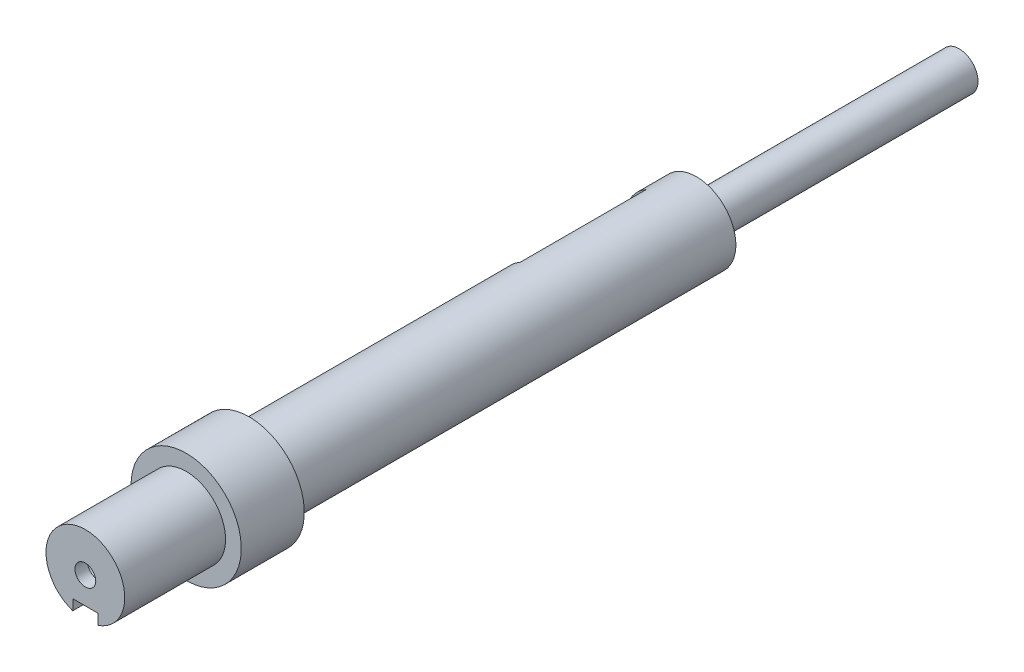
ISO-10303-21;
HEADER;
FILE_DESCRIPTION(('STEP AP214'),'2;1');
FILE_NAME('part.step','',(''),(''),'','','');
FILE_SCHEMA(('AUTOMOTIVE_DESIGN { 1 0 10303 214 1 1 1 1 }'));
ENDSEC;
DATA;
#1=APPLICATION_CONTEXT('core data for automotive mechanical design processes');
#2=APPLICATION_PROTOCOL_DEFINITION('international standard','automotive_design',2000,#1);
#3=PRODUCT_CONTEXT('',#1,'mechanical');
#4=PRODUCT('Part','Part','',(#3));
#5=PRODUCT_RELATED_PRODUCT_CATEGORY('part','',(#4));
#6=PRODUCT_DEFINITION_FORMATION('','',#4);
#7=PRODUCT_DEFINITION_CONTEXT('part definition',#1,'design');
#8=PRODUCT_DEFINITION('design','',#6,#7);
#9=PRODUCT_DEFINITION_SHAPE('','',#8);
#10=(LENGTH_UNIT() NAMED_UNIT(*) SI_UNIT(.MILLI.,.METRE.));
#11=(NAMED_UNIT(*) PLANE_ANGLE_UNIT() SI_UNIT($,.RADIAN.));
#12=(NAMED_UNIT(*) SI_UNIT($,.STERADIAN.) SOLID_ANGLE_UNIT());
#13=UNCERTAINTY_MEASURE_WITH_UNIT(LENGTH_MEASURE(1.E-05),#10,'distance_accuracy_value','');
#14=(GEOMETRIC_REPRESENTATION_CONTEXT(3) GLOBAL_UNCERTAINTY_ASSIGNED_CONTEXT((#13)) GLOBAL_UNIT_ASSIGNED_CONTEXT((#10,
#11,#12)) REPRESENTATION_CONTEXT('',''));
#15=CARTESIAN_POINT('',(0.,0.,0.));
#16=DIRECTION('',(0.,0.,1.));
#17=DIRECTION('',(1.,0.,0.));
#18=AXIS2_PLACEMENT_3D('',#15,#16,#17);
#19=CARTESIAN_POINT('',(0.,0.,0.));
#20=DIRECTION('',(0.,0.,1.));
#21=DIRECTION('',(1.,0.,0.));
#22=AXIS2_PLACEMENT_3D('',#19,#20,#21);
#23=PLANE('',#22);
#24=DIRECTION('',(1.,0.,0.));
#25=VECTOR('',#24,1.);
#26=CARTESIAN_POINT('',(0.,-8.5,0.));
#27=LINE('',#26,#25);
#28=CARTESIAN_POINT('',(-4.,-8.5,0.));
#29=VERTEX_POINT('',#28);
#30=CARTESIAN_POINT('',(4.,-8.5,0.));
#31=VERTEX_POINT('',#30);
#32=EDGE_CURVE('E54',#29,#31,#27,.T.);
#33=ORIENTED_EDGE('',*,*,#32,.F.);
#34=DIRECTION('',(0.,-1.,0.));
#35=VECTOR('',#34,1.);
#36=CARTESIAN_POINT('',(-4.,0.,0.));
#37=LINE('',#36,#35);
#38=CARTESIAN_POINT('',(-4.,-11.842719282327,0.));
#39=VERTEX_POINT('',#38);
#40=EDGE_CURVE('E135',#29,#39,#37,.T.);
#41=ORIENTED_EDGE('',*,*,#40,.T.);
#42=CARTESIAN_POINT('',(0.,0.,0.));
#43=DIRECTION('',(0.,0.,1.));
#44=DIRECTION('',(1.,0.,0.));
#45=AXIS2_PLACEMENT_3D('',#42,#43,#44);
#46=CIRCLE('',#45,12.5);
#47=CARTESIAN_POINT('',(4.,-11.842719282327,0.));
#48=VERTEX_POINT('',#47);
#49=EDGE_CURVE('E171',#39,#48,#46,.T.);
#50=ORIENTED_EDGE('',*,*,#49,.T.);
#51=DIRECTION('',(0.,-1.,0.));
#52=VECTOR('',#51,1.);
#53=CARTESIAN_POINT('',(4.00000000000001,0.,0.));
#54=LINE('',#53,#52);
#55=EDGE_CURVE('E59',#31,#48,#54,.T.);
#56=ORIENTED_EDGE('',*,*,#55,.F.);
#57=EDGE_LOOP('',(#33,#41,#50,#56));
#58=FACE_BOUND('',#57,.T.);
#59=ADVANCED_FACE('F37',(#58),#23,.T.);
#60=CARTESIAN_POINT('',(0.,0.,-22.));
#61=DIRECTION('',(0.,0.,-1.));
#62=DIRECTION('',(-1.,0.,0.));
#63=AXIS2_PLACEMENT_3D('',#60,#61,#62);
#64=CYLINDRICAL_SURFACE('',#63,17.5);
#65=CARTESIAN_POINT('',(0.,0.,-22.));
#66=DIRECTION('',(0.,0.,-1.));
#67=DIRECTION('',(-1.,0.,0.));
#68=AXIS2_PLACEMENT_3D('',#65,#66,#67);
#69=CIRCLE('',#68,17.5);
#70=CARTESIAN_POINT('',(-17.5,0.,-22.));
#71=VERTEX_POINT('',#70);
#72=EDGE_CURVE('E235',#71,#71,#69,.T.);
#73=ORIENTED_EDGE('',*,*,#72,.T.);
#74=EDGE_LOOP('',(#73));
#75=FACE_BOUND('',#74,.T.);
#76=CARTESIAN_POINT('',(0.,0.,-42.));
#77=DIRECTION('',(0.,0.,-1.));
#78=DIRECTION('',(-1.,0.,0.));
#79=AXIS2_PLACEMENT_3D('',#76,#77,#78);
#80=CIRCLE('',#79,17.5);
#81=CARTESIAN_POINT('',(-17.5,0.,-42.));
#82=VERTEX_POINT('',#81);
#83=EDGE_CURVE('E179',#82,#82,#80,.T.);
#84=ORIENTED_EDGE('',*,*,#83,.F.);
#85=EDGE_LOOP('',(#84));
#86=FACE_BOUND('',#85,.T.);
#87=ADVANCED_FACE('F243',(#75,#86),#64,.T.);
#88=CARTESIAN_POINT('',(0.,0.,-184.));
#89=DIRECTION('',(0.,0.,1.));
#90=DIRECTION('',(1.,0.,0.));
#91=AXIS2_PLACEMENT_3D('',#88,#89,#90);
#92=CYLINDRICAL_SURFACE('',#91,12.5);
#93=ORIENTED_EDGE('',*,*,#49,.F.);
#94=DIRECTION('',(0.,0.,-1.));
#95=VECTOR('',#94,1.);
#96=CARTESIAN_POINT('',(-4.,-11.842719282327,10.));
#97=LINE('',#96,#95);
#98=CARTESIAN_POINT('',(-4.,-11.842719282327,10.));
#99=VERTEX_POINT('',#98);
#100=EDGE_CURVE('E155',#99,#39,#97,.T.);
#101=ORIENTED_EDGE('',*,*,#100,.F.);
#102=CARTESIAN_POINT('',(0.,0.,10.));
#103=DIRECTION('',(0.,0.,1.));
#104=DIRECTION('',(1.,0.,0.));
#105=AXIS2_PLACEMENT_3D('',#102,#103,#104);
#106=CIRCLE('',#105,12.5);
#107=CARTESIAN_POINT('',(4.,-11.842719282327,10.));
#108=VERTEX_POINT('',#107);
#109=EDGE_CURVE('E137',#108,#99,#106,.T.);
#110=ORIENTED_EDGE('',*,*,#109,.F.);
#111=DIRECTION('',(0.,0.,-1.));
#112=VECTOR('',#111,1.);
#113=CARTESIAN_POINT('',(4.,-11.842719282327,10.));
#114=LINE('',#113,#112);
#115=EDGE_CURVE('E151',#108,#48,#114,.T.);
#116=ORIENTED_EDGE('',*,*,#115,.T.);
#117=EDGE_LOOP('',(#93,#101,#110,#116));
#118=FACE_BOUND('',#117,.T.);
#119=CARTESIAN_POINT('',(0.,0.,-22.));
#120=DIRECTION('',(0.,0.,-1.));
#121=DIRECTION('',(-1.,0.,0.));
#122=AXIS2_PLACEMENT_3D('',#119,#120,#121);
#123=CIRCLE('',#122,12.5);
#124=CARTESIAN_POINT('',(-12.5,0.,-22.));
#125=VERTEX_POINT('',#124);
#126=EDGE_CURVE('E46',#125,#125,#123,.T.);
#127=ORIENTED_EDGE('',*,*,#126,.F.);
#128=EDGE_LOOP('',(#127));
#129=FACE_BOUND('',#128,.T.);
#130=ADVANCED_FACE('F173',(#118,#129),#92,.T.);
#131=CARTESIAN_POINT('',(0.,0.,-22.));
#132=DIRECTION('',(0.,0.,-1.));
#133=DIRECTION('',(-1.,0.,0.));
#134=AXIS2_PLACEMENT_3D('',#131,#132,#133);
#135=PLANE('',#134);
#136=ORIENTED_EDGE('',*,*,#126,.T.);
#137=EDGE_LOOP('',(#136));
#138=FACE_BOUND('',#137,.T.);
#139=ORIENTED_EDGE('',*,*,#72,.F.);
#140=EDGE_LOOP('',(#139));
#141=FACE_BOUND('',#140,.T.);
#142=ADVANCED_FACE('F251',(#138,#141),#135,.F.);
#143=CARTESIAN_POINT('',(0.,0.,-42.));
#144=DIRECTION('',(0.,0.,-1.));
#145=DIRECTION('',(-1.,0.,0.));
#146=AXIS2_PLACEMENT_3D('',#143,#144,#145);
#147=PLANE('',#146);
#148=CARTESIAN_POINT('',(0.,0.,-42.));
#149=DIRECTION('',(0.,0.,-1.));
#150=DIRECTION('',(-1.,0.,0.));
#151=AXIS2_PLACEMENT_3D('',#148,#149,#150);
#152=CIRCLE('',#151,12.5);
#153=CARTESIAN_POINT('',(-12.5,0.,-42.));
#154=VERTEX_POINT('',#153);
#155=EDGE_CURVE('E177',#154,#154,#152,.T.);
#156=ORIENTED_EDGE('',*,*,#155,.F.);
#157=EDGE_LOOP('',(#156));
#158=FACE_BOUND('',#157,.T.);
#159=ORIENTED_EDGE('',*,*,#83,.T.);
#160=EDGE_LOOP('',(#159));
#161=FACE_BOUND('',#160,.T.);
#162=ADVANCED_FACE('F241',(#158,#161),#147,.T.);
#163=CARTESIAN_POINT('',(3.39095353514196,1.5,-264.38));
#164=DIRECTION('',(1.,0.,0.));
#165=DIRECTION('',(0.,1.,0.));
#166=AXIS2_PLACEMENT_3D('',#163,#164,#165);
#167=PLANE('',#166);
#168=DIRECTION('',(0.,-1.,0.));
#169=VECTOR('',#168,1.);
#170=CARTESIAN_POINT('',(3.39095353514196,1.5,-267.38));
#171=LINE('',#170,#169);
#172=CARTESIAN_POINT('',(3.39095353514196,1.5,-267.38));
#173=VERTEX_POINT('',#172);
#174=CARTESIAN_POINT('',(3.39095353514196,-1.5,-267.38));
#175=VERTEX_POINT('',#174);
#176=EDGE_CURVE('E215',#173,#175,#171,.T.);
#177=ORIENTED_EDGE('',*,*,#176,.T.);
#178=DIRECTION('',(0.,0.,-1.));
#179=VECTOR('',#178,1.);
#180=CARTESIAN_POINT('',(3.39095353514196,-1.5,-264.38));
#181=LINE('',#180,#179);
#182=CARTESIAN_POINT('',(3.39095353514196,-1.5,-264.38));
#183=VERTEX_POINT('',#182);
#184=EDGE_CURVE('E206',#183,#175,#181,.T.);
#185=ORIENTED_EDGE('',*,*,#184,.F.);
#186=DIRECTION('',(0.,-1.,0.));
#187=VECTOR('',#186,1.);
#188=CARTESIAN_POINT('',(3.39095353514196,1.5,-264.38));
#189=LINE('',#188,#187);
#190=CARTESIAN_POINT('',(3.39095353514196,1.5,-264.38));
#191=VERTEX_POINT('',#190);
#192=EDGE_CURVE('E221',#191,#183,#189,.T.);
#193=ORIENTED_EDGE('',*,*,#192,.F.);
#194=DIRECTION('',(0.,0.,-1.));
#195=VECTOR('',#194,1.);
#196=CARTESIAN_POINT('',(3.39095353514196,1.5,-264.38));
#197=LINE('',#196,#195);
#198=EDGE_CURVE('E207',#191,#173,#197,.T.);
#199=ORIENTED_EDGE('',*,*,#198,.T.);
#200=EDGE_LOOP('',(#177,#185,#193,#199));
#201=FACE_BOUND('',#200,.T.);
#202=ADVANCED_FACE('F279',(#201),#167,.F.);
#203=CARTESIAN_POINT('',(3.39095353514196,1.5,-264.38));
#204=DIRECTION('',(0.,1.,0.));
#205=DIRECTION('',(0.,0.,1.));
#206=AXIS2_PLACEMENT_3D('',#203,#204,#205);
#207=PLANE('',#206);
#208=DIRECTION('',(1.,0.,0.));
#209=VECTOR('',#208,1.);
#210=CARTESIAN_POINT('',(0.,1.5,-267.38));
#211=LINE('',#210,#209);
#212=CARTESIAN_POINT('',(-5.80947501931113,1.5,-267.38));
#213=VERTEX_POINT('',#212);
#214=EDGE_CURVE('E189',#213,#173,#211,.T.);
#215=ORIENTED_EDGE('',*,*,#214,.T.);
#216=ORIENTED_EDGE('',*,*,#198,.F.);
#217=DIRECTION('',(1.,0.,0.));
#218=VECTOR('',#217,1.);
#219=CARTESIAN_POINT('',(3.39095353514196,1.5,-264.38));
#220=LINE('',#219,#218);
#221=CARTESIAN_POINT('',(-5.80947501931113,1.5,-264.38));
#222=VERTEX_POINT('',#221);
#223=EDGE_CURVE('E214',#222,#191,#220,.T.);
#224=ORIENTED_EDGE('',*,*,#223,.F.);
#225=DIRECTION('',(0.,0.,1.));
#226=VECTOR('',#225,1.);
#227=CARTESIAN_POINT('',(-5.80947501931113,1.5,-267.38));
#228=LINE('',#227,#226);
#229=EDGE_CURVE('E203',#213,#222,#228,.T.);
#230=ORIENTED_EDGE('',*,*,#229,.F.);
#231=EDGE_LOOP('',(#215,#216,#224,#230));
#232=FACE_BOUND('',#231,.T.);
#233=ADVANCED_FACE('F282',(#232),#207,.F.);
#234=CARTESIAN_POINT('',(0.,0.,-267.38));
#235=DIRECTION('',(0.,0.,-1.));
#236=DIRECTION('',(-1.,0.,0.));
#237=AXIS2_PLACEMENT_3D('',#234,#235,#236);
#238=PLANE('',#237);
#239=DIRECTION('',(-1.,0.,0.));
#240=VECTOR('',#239,1.);
#241=CARTESIAN_POINT('',(3.39095353514196,-1.5,-267.38));
#242=LINE('',#241,#240);
#243=CARTESIAN_POINT('',(-5.80947501931113,-1.5,-267.38));
#244=VERTEX_POINT('',#243);
#245=EDGE_CURVE('E212',#175,#244,#242,.T.);
#246=ORIENTED_EDGE('',*,*,#245,.F.);
#247=ORIENTED_EDGE('',*,*,#176,.F.);
#248=ORIENTED_EDGE('',*,*,#214,.F.);
#249=CARTESIAN_POINT('',(0.,0.,-267.38));
#250=DIRECTION('',(0.,0.,-1.));
#251=DIRECTION('',(-1.,0.,0.));
#252=AXIS2_PLACEMENT_3D('',#249,#250,#251);
#253=CIRCLE('',#252,6.);
#254=EDGE_CURVE('E194',#213,#244,#253,.T.);
#255=ORIENTED_EDGE('',*,*,#254,.T.);
#256=EDGE_LOOP('',(#246,#247,#248,#255));
#257=FACE_BOUND('',#256,.T.);
#258=ADVANCED_FACE('F277',(#257),#238,.T.);
#259=CARTESIAN_POINT('',(3.39095353514196,-1.5,-264.38));
#260=DIRECTION('',(0.,-1.,0.));
#261=DIRECTION('',(0.,0.,-1.));
#262=AXIS2_PLACEMENT_3D('',#259,#260,#261);
#263=PLANE('',#262);
#264=DIRECTION('',(-1.,0.,0.));
#265=VECTOR('',#264,1.);
#266=CARTESIAN_POINT('',(3.39095353514196,-1.5,-264.38));
#267=LINE('',#266,#265);
#268=CARTESIAN_POINT('',(-5.80947501931113,-1.5,-264.38));
#269=VERTEX_POINT('',#268);
#270=EDGE_CURVE('E210',#183,#269,#267,.T.);
#271=ORIENTED_EDGE('',*,*,#270,.F.);
#272=ORIENTED_EDGE('',*,*,#184,.T.);
#273=ORIENTED_EDGE('',*,*,#245,.T.);
#274=DIRECTION('',(0.,0.,1.));
#275=VECTOR('',#274,1.);
#276=CARTESIAN_POINT('',(-5.80947501931113,-1.5,-267.38));
#277=LINE('',#276,#275);
#278=EDGE_CURVE('E198',#269,#244,#277,.F.);
#279=ORIENTED_EDGE('',*,*,#278,.F.);
#280=EDGE_LOOP('',(#271,#272,#273,#279));
#281=FACE_BOUND('',#280,.T.);
#282=ADVANCED_FACE('F273',(#281),#263,.F.);
#283=CARTESIAN_POINT('',(0.,0.,-264.38));
#284=DIRECTION('',(0.,0.,-1.));
#285=DIRECTION('',(-1.,0.,0.));
#286=AXIS2_PLACEMENT_3D('',#283,#284,#285);
#287=PLANE('',#286);
#288=CARTESIAN_POINT('',(0.,0.,-264.38));
#289=DIRECTION('',(0.,0.,-1.));
#290=DIRECTION('',(-1.,0.,0.));
#291=AXIS2_PLACEMENT_3D('',#288,#289,#290);
#292=CIRCLE('',#291,6.);
#293=EDGE_CURVE('E187',#269,#222,#292,.T.);
#294=ORIENTED_EDGE('',*,*,#293,.T.);
#295=ORIENTED_EDGE('',*,*,#223,.T.);
#296=ORIENTED_EDGE('',*,*,#192,.T.);
#297=ORIENTED_EDGE('',*,*,#270,.T.);
#298=EDGE_LOOP('',(#294,#295,#296,#297));
#299=FACE_BOUND('',#298,.T.);
#300=ADVANCED_FACE('F270',(#299),#287,.T.);
#301=CARTESIAN_POINT('',(0.,0.,-267.38));
#302=DIRECTION('',(0.,0.,1.));
#303=DIRECTION('',(1.,0.,0.));
#304=AXIS2_PLACEMENT_3D('',#301,#302,#303);
#305=CYLINDRICAL_SURFACE('',#304,6.);
#306=ORIENTED_EDGE('',*,*,#293,.F.);
#307=ORIENTED_EDGE('',*,*,#278,.T.);
#308=ORIENTED_EDGE('',*,*,#254,.F.);
#309=ORIENTED_EDGE('',*,*,#229,.T.);
#310=EDGE_LOOP('',(#306,#307,#308,#309));
#311=FACE_BOUND('',#310,.T.);
#312=CARTESIAN_POINT('',(0.,0.,-184.));
#313=DIRECTION('',(0.,0.,-1.));
#314=DIRECTION('',(-1.,0.,0.));
#315=AXIS2_PLACEMENT_3D('',#312,#313,#314);
#316=CIRCLE('',#315,6.);
#317=CARTESIAN_POINT('',(-6.,0.,-184.));
#318=VERTEX_POINT('',#317);
#319=EDGE_CURVE('E195',#318,#318,#316,.T.);
#320=ORIENTED_EDGE('',*,*,#319,.T.);
#321=EDGE_LOOP('',(#320));
#322=FACE_BOUND('',#321,.T.);
#323=ADVANCED_FACE('F260',(#311,#322),#305,.T.);
#324=CARTESIAN_POINT('',(0.,0.,-174.));
#325=DIRECTION('',(0.,0.,-1.));
#326=DIRECTION('',(-1.,0.,0.));
#327=AXIS2_PLACEMENT_3D('',#324,#325,#326);
#328=PLANE('',#327);
#329=CARTESIAN_POINT('',(0.,0.,-174.));
#330=DIRECTION('',(0.,0.,-1.));
#331=DIRECTION('',(-1.,0.,0.));
#332=AXIS2_PLACEMENT_3D('',#329,#330,#331);
#333=CIRCLE('',#332,12.5);
#334=CARTESIAN_POINT('',(-6.,-10.9658560997307,-174.));
#335=VERTEX_POINT('',#334);
#336=CARTESIAN_POINT('',(-6.,10.9658560997307,-174.));
#337=VERTEX_POINT('',#336);
#338=EDGE_CURVE('E232',#335,#337,#333,.T.);
#339=ORIENTED_EDGE('',*,*,#338,.F.);
#340=DIRECTION('',(0.,1.,0.));
#341=VECTOR('',#340,1.);
#342=CARTESIAN_POINT('',(-6.,10.9658560997307,-174.));
#343=LINE('',#342,#341);
#344=EDGE_CURVE('E184',#335,#337,#343,.T.);
#345=ORIENTED_EDGE('',*,*,#344,.T.);
#346=EDGE_LOOP('',(#339,#345));
#347=FACE_BOUND('',#346,.T.);
#348=ADVANCED_FACE('F256',(#347),#328,.F.);
#349=CARTESIAN_POINT('',(0.,0.,-134.));
#350=DIRECTION('',(0.,0.,1.));
#351=DIRECTION('',(1.,0.,0.));
#352=AXIS2_PLACEMENT_3D('',#349,#350,#351);
#353=PLANE('',#352);
#354=CARTESIAN_POINT('',(0.,0.,-134.));
#355=DIRECTION('',(0.,0.,1.));
#356=DIRECTION('',(1.,0.,0.));
#357=AXIS2_PLACEMENT_3D('',#354,#355,#356);
#358=CIRCLE('',#357,12.5);
#359=CARTESIAN_POINT('',(-6.,10.9658560997307,-134.));
#360=VERTEX_POINT('',#359);
#361=CARTESIAN_POINT('',(-6.,-10.9658560997307,-134.));
#362=VERTEX_POINT('',#361);
#363=EDGE_CURVE('E11',#360,#362,#358,.T.);
#364=ORIENTED_EDGE('',*,*,#363,.F.);
#365=DIRECTION('',(0.,-1.,0.));
#366=VECTOR('',#365,1.);
#367=CARTESIAN_POINT('',(-6.,10.9658560997307,-134.));
#368=LINE('',#367,#366);
#369=EDGE_CURVE('E227',#360,#362,#368,.T.);
#370=ORIENTED_EDGE('',*,*,#369,.T.);
#371=EDGE_LOOP('',(#364,#370));
#372=FACE_BOUND('',#371,.T.);
#373=ADVANCED_FACE('F259',(#372),#353,.F.);
#374=CARTESIAN_POINT('',(-6.,10.9658560997307,-134.));
#375=DIRECTION('',(1.,0.,0.));
#376=DIRECTION('',(0.,0.,-1.));
#377=AXIS2_PLACEMENT_3D('',#374,#375,#376);
#378=PLANE('',#377);
#379=ORIENTED_EDGE('',*,*,#344,.F.);
#380=DIRECTION('',(0.,0.,-1.));
#381=VECTOR('',#380,1.);
#382=CARTESIAN_POINT('',(-6.,-10.9658560997307,-134.));
#383=LINE('',#382,#381);
#384=EDGE_CURVE('E218',#362,#335,#383,.T.);
#385=ORIENTED_EDGE('',*,*,#384,.F.);
#386=ORIENTED_EDGE('',*,*,#369,.F.);
#387=DIRECTION('',(0.,0.,-1.));
#388=VECTOR('',#387,1.);
#389=CARTESIAN_POINT('',(-6.,10.9658560997307,-134.));
#390=LINE('',#389,#388);
#391=EDGE_CURVE('E225',#360,#337,#390,.T.);
#392=ORIENTED_EDGE('',*,*,#391,.T.);
#393=EDGE_LOOP('',(#379,#385,#386,#392));
#394=FACE_BOUND('',#393,.T.);
#395=ADVANCED_FACE('F264',(#394),#378,.F.);
#396=CARTESIAN_POINT('',(0.,0.,-184.));
#397=DIRECTION('',(0.,0.,-1.));
#398=DIRECTION('',(-1.,0.,0.));
#399=AXIS2_PLACEMENT_3D('',#396,#397,#398);
#400=PLANE('',#399);
#401=CARTESIAN_POINT('',(0.,0.,-184.));
#402=DIRECTION('',(0.,0.,-1.));
#403=DIRECTION('',(-1.,0.,0.));
#404=AXIS2_PLACEMENT_3D('',#401,#402,#403);
#405=CIRCLE('',#404,12.5);
#406=CARTESIAN_POINT('',(-12.5,0.,-184.));
#407=VERTEX_POINT('',#406);
#408=EDGE_CURVE('E191',#407,#407,#405,.T.);
#409=ORIENTED_EDGE('',*,*,#408,.T.);
#410=EDGE_LOOP('',(#409));
#411=FACE_BOUND('',#410,.T.);
#412=ORIENTED_EDGE('',*,*,#319,.F.);
#413=EDGE_LOOP('',(#412));
#414=FACE_BOUND('',#413,.T.);
#415=ADVANCED_FACE('F268',(#411,#414),#400,.T.);
#416=ORIENTED_EDGE('',*,*,#408,.F.);
#417=EDGE_LOOP('',(#416));
#418=FACE_BOUND('',#417,.T.);
#419=ORIENTED_EDGE('',*,*,#391,.F.);
#420=ORIENTED_EDGE('',*,*,#363,.T.);
#421=ORIENTED_EDGE('',*,*,#384,.T.);
#422=ORIENTED_EDGE('',*,*,#338,.T.);
#423=EDGE_LOOP('',(#419,#420,#421,#422));
#424=FACE_BOUND('',#423,.T.);
#425=ORIENTED_EDGE('',*,*,#155,.T.);
#426=EDGE_LOOP('',(#425));
#427=FACE_BOUND('',#426,.T.);
#428=ADVANCED_FACE('F39',(#418,#424,#427),#92,.T.);
#429=CARTESIAN_POINT('',(0.,-8.5,10.));
#430=DIRECTION('',(0.,1.,0.));
#431=DIRECTION('',(0.,0.,1.));
#432=AXIS2_PLACEMENT_3D('',#429,#430,#431);
#433=PLANE('',#432);
#434=ORIENTED_EDGE('',*,*,#32,.T.);
#435=DIRECTION('',(0.,0.,-1.));
#436=VECTOR('',#435,1.);
#437=CARTESIAN_POINT('',(4.,-8.5,10.));
#438=LINE('',#437,#436);
#439=CARTESIAN_POINT('',(4.,-8.5,10.));
#440=VERTEX_POINT('',#439);
#441=EDGE_CURVE('E154',#440,#31,#438,.T.);
#442=ORIENTED_EDGE('',*,*,#441,.F.);
#443=DIRECTION('',(1.,0.,0.));
#444=VECTOR('',#443,1.);
#445=CARTESIAN_POINT('',(0.,-8.5,10.));
#446=LINE('',#445,#444);
#447=CARTESIAN_POINT('',(-4.,-8.5,10.));
#448=VERTEX_POINT('',#447);
#449=EDGE_CURVE('E131',#448,#440,#446,.T.);
#450=ORIENTED_EDGE('',*,*,#449,.F.);
#451=DIRECTION('',(0.,0.,-1.));
#452=VECTOR('',#451,1.);
#453=CARTESIAN_POINT('',(-4.,-8.5,10.));
#454=LINE('',#453,#452);
#455=EDGE_CURVE('E141',#448,#29,#454,.T.);
#456=ORIENTED_EDGE('',*,*,#455,.T.);
#457=EDGE_LOOP('',(#434,#442,#450,#456));
#458=FACE_BOUND('',#457,.T.);
#459=ADVANCED_FACE('F166',(#458),#433,.F.);
#460=CARTESIAN_POINT('',(4.00000000000001,0.,10.));
#461=DIRECTION('',(1.,0.,0.));
#462=DIRECTION('',(0.,1.,0.));
#463=AXIS2_PLACEMENT_3D('',#460,#461,#462);
#464=PLANE('',#463);
#465=ORIENTED_EDGE('',*,*,#55,.T.);
#466=ORIENTED_EDGE('',*,*,#115,.F.);
#467=DIRECTION('',(0.,-1.,0.));
#468=VECTOR('',#467,1.);
#469=CARTESIAN_POINT('',(4.00000000000001,0.,10.));
#470=LINE('',#469,#468);
#471=EDGE_CURVE('E134',#440,#108,#470,.T.);
#472=ORIENTED_EDGE('',*,*,#471,.F.);
#473=ORIENTED_EDGE('',*,*,#441,.T.);
#474=EDGE_LOOP('',(#465,#466,#472,#473));
#475=FACE_BOUND('',#474,.T.);
#476=ADVANCED_FACE('F315',(#475),#464,.F.);
#477=CARTESIAN_POINT('',(-4.,0.,10.));
#478=DIRECTION('',(1.,0.,0.));
#479=DIRECTION('',(0.,1.,0.));
#480=AXIS2_PLACEMENT_3D('',#477,#478,#479);
#481=PLANE('',#480);
#482=ORIENTED_EDGE('',*,*,#40,.F.);
#483=ORIENTED_EDGE('',*,*,#455,.F.);
#484=DIRECTION('',(0.,-1.,0.));
#485=VECTOR('',#484,1.);
#486=CARTESIAN_POINT('',(-4.,0.,10.));
#487=LINE('',#486,#485);
#488=EDGE_CURVE('E139',#448,#99,#487,.T.);
#489=ORIENTED_EDGE('',*,*,#488,.T.);
#490=ORIENTED_EDGE('',*,*,#100,.T.);
#491=EDGE_LOOP('',(#482,#483,#489,#490));
#492=FACE_BOUND('',#491,.T.);
#493=ADVANCED_FACE('F169',(#492),#481,.T.);
#494=CARTESIAN_POINT('',(0.,0.,10.));
#495=DIRECTION('',(0.,0.,1.));
#496=DIRECTION('',(1.,0.,0.));
#497=AXIS2_PLACEMENT_3D('',#494,#495,#496);
#498=PLANE('',#497);
#499=CARTESIAN_POINT('',(0.,0.,10.));
#500=DIRECTION('',(0.,0.,1.));
#501=DIRECTION('',(1.,0.,0.));
#502=AXIS2_PLACEMENT_3D('',#499,#500,#501);
#503=CIRCLE('',#502,3.29999999999999);
#504=CARTESIAN_POINT('',(3.29999999999999,0.,10.));
#505=VERTEX_POINT('',#504);
#506=EDGE_CURVE('E125',#505,#505,#503,.T.);
#507=ORIENTED_EDGE('',*,*,#506,.F.);
#508=EDGE_LOOP('',(#507));
#509=FACE_BOUND('',#508,.T.);
#510=ORIENTED_EDGE('',*,*,#449,.T.);
#511=ORIENTED_EDGE('',*,*,#471,.T.);
#512=ORIENTED_EDGE('',*,*,#109,.T.);
#513=ORIENTED_EDGE('',*,*,#488,.F.);
#514=EDGE_LOOP('',(#510,#511,#512,#513));
#515=FACE_BOUND('',#514,.T.);
#516=ADVANCED_FACE('F119',(#509,#515),#498,.T.);
#517=CARTESIAN_POINT('',(0.,0.,6.));
#518=DIRECTION('',(0.,0.,1.));
#519=DIRECTION('',(1.,0.,0.));
#520=AXIS2_PLACEMENT_3D('',#517,#518,#519);
#521=CONICAL_SURFACE('',#520,3.3,1.0471975511966);
#522=CARTESIAN_POINT('',(0.,0.,4.09474411167423));
#523=VERTEX_POINT('',#522);
#524=VERTEX_LOOP('',#523);
#525=FACE_BOUND('',#524,.T.);
#526=CARTESIAN_POINT('',(0.,0.,6.));
#527=DIRECTION('',(0.,0.,1.));
#528=DIRECTION('',(1.,0.,0.));
#529=AXIS2_PLACEMENT_3D('',#526,#527,#528);
#530=CIRCLE('',#529,3.3);
#531=CARTESIAN_POINT('',(3.3,0.,6.));
#532=VERTEX_POINT('',#531);
#533=EDGE_CURVE('E123',#532,#532,#530,.T.);
#534=ORIENTED_EDGE('',*,*,#533,.T.);
#535=EDGE_LOOP('',(#534));
#536=FACE_BOUND('',#535,.T.);
#537=ADVANCED_FACE('F115',(#525,#536),#521,.F.);
#538=CARTESIAN_POINT('',(0.,0.,10.));
#539=DIRECTION('',(0.,0.,1.));
#540=DIRECTION('',(1.,0.,0.));
#541=AXIS2_PLACEMENT_3D('',#538,#539,#540);
#542=CYLINDRICAL_SURFACE('',#541,3.29999999999999);
#543=ORIENTED_EDGE('',*,*,#533,.F.);
#544=EDGE_LOOP('',(#543));
#545=FACE_BOUND('',#544,.T.);
#546=ORIENTED_EDGE('',*,*,#506,.T.);
#547=EDGE_LOOP('',(#546));
#548=FACE_BOUND('',#547,.T.);
#549=ADVANCED_FACE('F118',(#545,#548),#542,.F.);
#550=CLOSED_SHELL('',(#59,#87,#130,#142,#162,#202,#233,#258,#282,#300,#323,#348,#373,#395,#415,
#428,#459,#476,#493,#516,#537,#549));
#551=MANIFOLD_SOLID_BREP('B2',#550);
#552=ADVANCED_BREP_SHAPE_REPRESENTATION('',(#18,#551),#14);
#553=SHAPE_DEFINITION_REPRESENTATION(#9,#552);
ENDSEC;
END-ISO-10303-21;
